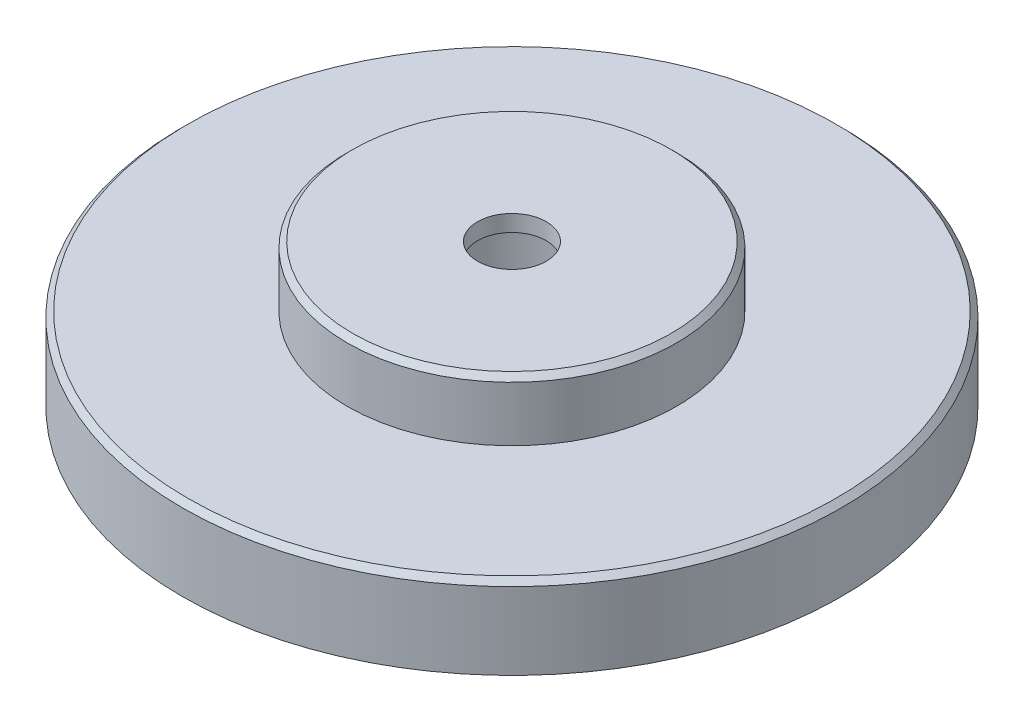
ISO-10303-21;
HEADER;
FILE_DESCRIPTION(('STEP AP214'),'2;1');
FILE_NAME('part.step','',(''),(''),'','','');
FILE_SCHEMA(('AUTOMOTIVE_DESIGN { 1 0 10303 214 1 1 1 1 }'));
ENDSEC;
DATA;
#1=APPLICATION_CONTEXT('core data for automotive mechanical design processes');
#2=APPLICATION_PROTOCOL_DEFINITION('international standard','automotive_design',2000,#1);
#3=PRODUCT_CONTEXT('',#1,'mechanical');
#4=PRODUCT('Part','Part','',(#3));
#5=PRODUCT_RELATED_PRODUCT_CATEGORY('part','',(#4));
#6=PRODUCT_DEFINITION_FORMATION('','',#4);
#7=PRODUCT_DEFINITION_CONTEXT('part definition',#1,'design');
#8=PRODUCT_DEFINITION('design','',#6,#7);
#9=PRODUCT_DEFINITION_SHAPE('','',#8);
#10=(LENGTH_UNIT() NAMED_UNIT(*) SI_UNIT(.MILLI.,.METRE.));
#11=(NAMED_UNIT(*) PLANE_ANGLE_UNIT() SI_UNIT($,.RADIAN.));
#12=(NAMED_UNIT(*) SI_UNIT($,.STERADIAN.) SOLID_ANGLE_UNIT());
#13=UNCERTAINTY_MEASURE_WITH_UNIT(LENGTH_MEASURE(1.E-05),#10,'distance_accuracy_value','');
#14=(GEOMETRIC_REPRESENTATION_CONTEXT(3) GLOBAL_UNCERTAINTY_ASSIGNED_CONTEXT((#13)) GLOBAL_UNIT_ASSIGNED_CONTEXT((#10,
#11,#12)) REPRESENTATION_CONTEXT('',''));
#15=CARTESIAN_POINT('',(0.,0.,0.));
#16=DIRECTION('',(0.,0.,1.));
#17=DIRECTION('',(1.,0.,0.));
#18=AXIS2_PLACEMENT_3D('',#15,#16,#17);
#19=CARTESIAN_POINT('',(0.,0.,0.));
#20=DIRECTION('',(0.,1.,0.));
#21=DIRECTION('',(0.,0.,1.));
#22=AXIS2_PLACEMENT_3D('',#19,#20,#21);
#23=PLANE('',#22);
#24=CARTESIAN_POINT('',(0.,0.,0.));
#25=DIRECTION('',(0.,1.,0.));
#26=DIRECTION('',(0.,0.,1.));
#27=AXIS2_PLACEMENT_3D('',#24,#25,#26);
#28=CIRCLE('',#27,12.);
#29=CARTESIAN_POINT('',(0.,0.,12.));
#30=VERTEX_POINT('',#29);
#31=EDGE_CURVE('E138',#30,#30,#28,.T.);
#32=ORIENTED_EDGE('',*,*,#31,.F.);
#33=EDGE_LOOP('',(#32));
#34=FACE_BOUND('',#33,.T.);
#35=DIRECTION('',(0.5,0.,0.866025403784439));
#36=VECTOR('',#35,1.);
#37=CARTESIAN_POINT('',(-9.81495457622364,0.,0.));
#38=LINE('',#37,#36);
#39=CARTESIAN_POINT('',(-9.81495457622364,0.,0.));
#40=VERTEX_POINT('',#39);
#41=CARTESIAN_POINT('',(-4.90747728811182,0.,8.5));
#42=VERTEX_POINT('',#41);
#43=EDGE_CURVE('E57',#40,#42,#38,.T.);
#44=ORIENTED_EDGE('',*,*,#43,.T.);
#45=DIRECTION('',(1.,0.,0.));
#46=VECTOR('',#45,1.);
#47=CARTESIAN_POINT('',(-4.90747728811182,0.,8.5));
#48=LINE('',#47,#46);
#49=CARTESIAN_POINT('',(4.90747728811182,0.,8.5));
#50=VERTEX_POINT('',#49);
#51=EDGE_CURVE('E117',#42,#50,#48,.T.);
#52=ORIENTED_EDGE('',*,*,#51,.T.);
#53=DIRECTION('',(0.5,0.,-0.866025403784439));
#54=VECTOR('',#53,1.);
#55=CARTESIAN_POINT('',(4.90747728811182,0.,8.5));
#56=LINE('',#55,#54);
#57=CARTESIAN_POINT('',(9.81495457622364,0.,0.));
#58=VERTEX_POINT('',#57);
#59=EDGE_CURVE('E113',#50,#58,#56,.T.);
#60=ORIENTED_EDGE('',*,*,#59,.T.);
#61=DIRECTION('',(-0.5,0.,-0.866025403784439));
#62=VECTOR('',#61,1.);
#63=CARTESIAN_POINT('',(9.81495457622364,0.,0.));
#64=LINE('',#63,#62);
#65=CARTESIAN_POINT('',(4.90747728811182,0.,-8.50000000000001));
#66=VERTEX_POINT('',#65);
#67=EDGE_CURVE('E92',#58,#66,#64,.T.);
#68=ORIENTED_EDGE('',*,*,#67,.T.);
#69=DIRECTION('',(-1.,0.,0.));
#70=VECTOR('',#69,1.);
#71=CARTESIAN_POINT('',(4.90747728811182,0.,-8.50000000000001));
#72=LINE('',#71,#70);
#73=CARTESIAN_POINT('',(-4.90747728811182,0.,-8.50000000000001));
#74=VERTEX_POINT('',#73);
#75=EDGE_CURVE('E102',#66,#74,#72,.T.);
#76=ORIENTED_EDGE('',*,*,#75,.T.);
#77=DIRECTION('',(-0.5,0.,0.866025403784439));
#78=VECTOR('',#77,1.);
#79=CARTESIAN_POINT('',(-4.90747728811182,0.,-8.50000000000001));
#80=LINE('',#79,#78);
#81=EDGE_CURVE('E109',#74,#40,#80,.T.);
#82=ORIENTED_EDGE('',*,*,#81,.T.);
#83=EDGE_LOOP('',(#44,#52,#60,#68,#76,#82));
#84=FACE_BOUND('',#83,.T.);
#85=ADVANCED_FACE('F40',(#34,#84),#23,.F.);
#86=CARTESIAN_POINT('',(0.,2.,0.));
#87=DIRECTION('',(0.,-1.,0.));
#88=DIRECTION('',(0.,0.,-1.));
#89=AXIS2_PLACEMENT_3D('',#86,#87,#88);
#90=CYLINDRICAL_SURFACE('',#89,12.);
#91=CARTESIAN_POINT('',(0.,2.8,0.));
#92=DIRECTION('',(0.,1.,0.));
#93=DIRECTION('',(0.,0.,1.));
#94=AXIS2_PLACEMENT_3D('',#91,#92,#93);
#95=CIRCLE('',#94,12.);
#96=CARTESIAN_POINT('',(0.,2.8,12.));
#97=VERTEX_POINT('',#96);
#98=EDGE_CURVE('E11',#97,#97,#95,.F.);
#99=ORIENTED_EDGE('',*,*,#98,.T.);
#100=EDGE_LOOP('',(#99));
#101=FACE_BOUND('',#100,.T.);
#102=ORIENTED_EDGE('',*,*,#31,.T.);
#103=EDGE_LOOP('',(#102));
#104=FACE_BOUND('',#103,.T.);
#105=ADVANCED_FACE('F167',(#101,#104),#90,.T.);
#106=CARTESIAN_POINT('',(-9.81495457622364,2.,0.));
#107=DIRECTION('',(0.866025403784439,0.,-0.5));
#108=DIRECTION('',(-0.5,0.,-0.866025403784439));
#109=AXIS2_PLACEMENT_3D('',#106,#107,#108);
#110=PLANE('',#109);
#111=ORIENTED_EDGE('',*,*,#43,.F.);
#112=DIRECTION('',(0.,-1.,0.));
#113=VECTOR('',#112,1.);
#114=CARTESIAN_POINT('',(-9.81495457622364,2.,0.));
#115=LINE('',#114,#113);
#116=CARTESIAN_POINT('',(-9.81495457622364,2.,0.));
#117=VERTEX_POINT('',#116);
#118=EDGE_CURVE('E124',#117,#40,#115,.T.);
#119=ORIENTED_EDGE('',*,*,#118,.F.);
#120=DIRECTION('',(0.5,0.,0.866025403784439));
#121=VECTOR('',#120,1.);
#122=CARTESIAN_POINT('',(-9.81495457622364,2.,0.));
#123=LINE('',#122,#121);
#124=CARTESIAN_POINT('',(-4.90747728811182,2.,8.5));
#125=VERTEX_POINT('',#124);
#126=EDGE_CURVE('E123',#117,#125,#123,.T.);
#127=ORIENTED_EDGE('',*,*,#126,.T.);
#128=DIRECTION('',(0.,-1.,0.));
#129=VECTOR('',#128,1.);
#130=CARTESIAN_POINT('',(-4.90747728811182,2.,8.5));
#131=LINE('',#130,#129);
#132=EDGE_CURVE('E135',#125,#42,#131,.T.);
#133=ORIENTED_EDGE('',*,*,#132,.T.);
#134=EDGE_LOOP('',(#111,#119,#127,#133));
#135=FACE_BOUND('',#134,.T.);
#136=ADVANCED_FACE('F174',(#135),#110,.T.);
#137=CARTESIAN_POINT('',(-4.90747728811182,2.,8.5));
#138=DIRECTION('',(0.,0.,-1.));
#139=DIRECTION('',(-1.,0.,0.));
#140=AXIS2_PLACEMENT_3D('',#137,#138,#139);
#141=PLANE('',#140);
#142=ORIENTED_EDGE('',*,*,#51,.F.);
#143=ORIENTED_EDGE('',*,*,#132,.F.);
#144=DIRECTION('',(1.,0.,0.));
#145=VECTOR('',#144,1.);
#146=CARTESIAN_POINT('',(-4.90747728811182,2.,8.5));
#147=LINE('',#146,#145);
#148=CARTESIAN_POINT('',(4.90747728811182,2.,8.5));
#149=VERTEX_POINT('',#148);
#150=EDGE_CURVE('E254',#125,#149,#147,.T.);
#151=ORIENTED_EDGE('',*,*,#150,.T.);
#152=DIRECTION('',(0.,-1.,0.));
#153=VECTOR('',#152,1.);
#154=CARTESIAN_POINT('',(4.90747728811182,2.,8.5));
#155=LINE('',#154,#153);
#156=EDGE_CURVE('E132',#149,#50,#155,.T.);
#157=ORIENTED_EDGE('',*,*,#156,.T.);
#158=EDGE_LOOP('',(#142,#143,#151,#157));
#159=FACE_BOUND('',#158,.T.);
#160=ADVANCED_FACE('F186',(#159),#141,.T.);
#161=CARTESIAN_POINT('',(4.90747728811182,2.,8.5));
#162=DIRECTION('',(-0.866025403784439,0.,-0.5));
#163=DIRECTION('',(-0.5,0.,0.866025403784439));
#164=AXIS2_PLACEMENT_3D('',#161,#162,#163);
#165=PLANE('',#164);
#166=ORIENTED_EDGE('',*,*,#59,.F.);
#167=ORIENTED_EDGE('',*,*,#156,.F.);
#168=DIRECTION('',(0.5,0.,-0.866025403784439));
#169=VECTOR('',#168,1.);
#170=CARTESIAN_POINT('',(4.90747728811182,2.,8.5));
#171=LINE('',#170,#169);
#172=CARTESIAN_POINT('',(9.81495457622364,2.,0.));
#173=VERTEX_POINT('',#172);
#174=EDGE_CURVE('E258',#149,#173,#171,.T.);
#175=ORIENTED_EDGE('',*,*,#174,.T.);
#176=DIRECTION('',(0.,-1.,0.));
#177=VECTOR('',#176,1.);
#178=CARTESIAN_POINT('',(9.81495457622364,2.,0.));
#179=LINE('',#178,#177);
#180=EDGE_CURVE('E98',#173,#58,#179,.T.);
#181=ORIENTED_EDGE('',*,*,#180,.T.);
#182=EDGE_LOOP('',(#166,#167,#175,#181));
#183=FACE_BOUND('',#182,.T.);
#184=ADVANCED_FACE('F189',(#183),#165,.T.);
#185=CARTESIAN_POINT('',(9.81495457622364,2.,0.));
#186=DIRECTION('',(-0.866025403784439,0.,0.5));
#187=DIRECTION('',(0.5,0.,0.866025403784439));
#188=AXIS2_PLACEMENT_3D('',#185,#186,#187);
#189=PLANE('',#188);
#190=ORIENTED_EDGE('',*,*,#67,.F.);
#191=ORIENTED_EDGE('',*,*,#180,.F.);
#192=DIRECTION('',(-0.5,0.,-0.866025403784439));
#193=VECTOR('',#192,1.);
#194=CARTESIAN_POINT('',(9.81495457622364,2.,0.));
#195=LINE('',#194,#193);
#196=CARTESIAN_POINT('',(4.90747728811182,2.,-8.50000000000001));
#197=VERTEX_POINT('',#196);
#198=EDGE_CURVE('E66',#173,#197,#195,.T.);
#199=ORIENTED_EDGE('',*,*,#198,.T.);
#200=DIRECTION('',(0.,-1.,0.));
#201=VECTOR('',#200,1.);
#202=CARTESIAN_POINT('',(4.90747728811182,2.,-8.50000000000001));
#203=LINE('',#202,#201);
#204=EDGE_CURVE('E87',#197,#66,#203,.T.);
#205=ORIENTED_EDGE('',*,*,#204,.T.);
#206=EDGE_LOOP('',(#190,#191,#199,#205));
#207=FACE_BOUND('',#206,.T.);
#208=ADVANCED_FACE('F89',(#207),#189,.T.);
#209=CARTESIAN_POINT('',(4.90747728811182,2.,-8.50000000000001));
#210=DIRECTION('',(0.,0.,1.));
#211=DIRECTION('',(1.,0.,0.));
#212=AXIS2_PLACEMENT_3D('',#209,#210,#211);
#213=PLANE('',#212);
#214=ORIENTED_EDGE('',*,*,#75,.F.);
#215=ORIENTED_EDGE('',*,*,#204,.F.);
#216=DIRECTION('',(-1.,0.,0.));
#217=VECTOR('',#216,1.);
#218=CARTESIAN_POINT('',(4.90747728811182,2.,-8.50000000000001));
#219=LINE('',#218,#217);
#220=CARTESIAN_POINT('',(-4.90747728811182,2.,-8.5));
#221=VERTEX_POINT('',#220);
#222=EDGE_CURVE('E263',#197,#221,#219,.T.);
#223=ORIENTED_EDGE('',*,*,#222,.T.);
#224=DIRECTION('',(0.,-1.,0.));
#225=VECTOR('',#224,1.);
#226=CARTESIAN_POINT('',(-4.90747728811182,2.,-8.50000000000001));
#227=LINE('',#226,#225);
#228=EDGE_CURVE('E99',#221,#74,#227,.T.);
#229=ORIENTED_EDGE('',*,*,#228,.T.);
#230=EDGE_LOOP('',(#214,#215,#223,#229));
#231=FACE_BOUND('',#230,.T.);
#232=ADVANCED_FACE('F103',(#231),#213,.T.);
#233=CARTESIAN_POINT('',(-4.90747728811182,2.,-8.50000000000001));
#234=DIRECTION('',(0.866025403784438,0.,0.5));
#235=DIRECTION('',(0.5,0.,-0.866025403784439));
#236=AXIS2_PLACEMENT_3D('',#233,#234,#235);
#237=PLANE('',#236);
#238=ORIENTED_EDGE('',*,*,#81,.F.);
#239=ORIENTED_EDGE('',*,*,#228,.F.);
#240=DIRECTION('',(-0.5,0.,0.866025403784439));
#241=VECTOR('',#240,1.);
#242=CARTESIAN_POINT('',(-4.90747728811182,2.,-8.50000000000001));
#243=LINE('',#242,#241);
#244=EDGE_CURVE('E127',#221,#117,#243,.T.);
#245=ORIENTED_EDGE('',*,*,#244,.T.);
#246=ORIENTED_EDGE('',*,*,#118,.T.);
#247=EDGE_LOOP('',(#238,#239,#245,#246));
#248=FACE_BOUND('',#247,.T.);
#249=ADVANCED_FACE('F198',(#248),#237,.T.);
#250=CARTESIAN_POINT('',(0.,2.,0.));
#251=DIRECTION('',(0.,1.,0.));
#252=DIRECTION('',(0.,0.,1.));
#253=AXIS2_PLACEMENT_3D('',#250,#251,#252);
#254=PLANE('',#253);
#255=CARTESIAN_POINT('',(0.,2.,0.));
#256=DIRECTION('',(0.,-1.,0.));
#257=DIRECTION('',(0.,0.,-1.));
#258=AXIS2_PLACEMENT_3D('',#255,#256,#257);
#259=CIRCLE('',#258,3.);
#260=CARTESIAN_POINT('',(0.,2.,-3.));
#261=VERTEX_POINT('',#260);
#262=EDGE_CURVE('E236',#261,#261,#259,.T.);
#263=ORIENTED_EDGE('',*,*,#262,.F.);
#264=EDGE_LOOP('',(#263));
#265=FACE_BOUND('',#264,.T.);
#266=ORIENTED_EDGE('',*,*,#150,.F.);
#267=ORIENTED_EDGE('',*,*,#126,.F.);
#268=ORIENTED_EDGE('',*,*,#244,.F.);
#269=ORIENTED_EDGE('',*,*,#222,.F.);
#270=ORIENTED_EDGE('',*,*,#198,.F.);
#271=ORIENTED_EDGE('',*,*,#174,.F.);
#272=EDGE_LOOP('',(#266,#267,#268,#269,#270,#271));
#273=FACE_BOUND('',#272,.T.);
#274=ADVANCED_FACE('F201',(#265,#273),#254,.F.);
#275=CARTESIAN_POINT('',(0.,3.,0.));
#276=DIRECTION('',(0.,1.,0.));
#277=DIRECTION('',(0.,0.,1.));
#278=AXIS2_PLACEMENT_3D('',#275,#276,#277);
#279=PLANE('',#278);
#280=CARTESIAN_POINT('',(0.,3.,0.));
#281=DIRECTION('',(0.,1.,0.));
#282=DIRECTION('',(0.,0.,1.));
#283=AXIS2_PLACEMENT_3D('',#280,#281,#282);
#284=CIRCLE('',#283,11.8);
#285=CARTESIAN_POINT('',(0.,3.,11.8));
#286=VERTEX_POINT('',#285);
#287=EDGE_CURVE('E50',#286,#286,#284,.T.);
#288=ORIENTED_EDGE('',*,*,#287,.T.);
#289=EDGE_LOOP('',(#288));
#290=FACE_BOUND('',#289,.T.);
#291=CARTESIAN_POINT('',(0.,3.,0.));
#292=DIRECTION('',(0.,1.,0.));
#293=DIRECTION('',(0.,0.,1.));
#294=AXIS2_PLACEMENT_3D('',#291,#292,#293);
#295=CIRCLE('',#294,6.);
#296=CARTESIAN_POINT('',(0.,3.,6.));
#297=VERTEX_POINT('',#296);
#298=EDGE_CURVE('E142',#297,#297,#295,.T.);
#299=ORIENTED_EDGE('',*,*,#298,.F.);
#300=EDGE_LOOP('',(#299));
#301=FACE_BOUND('',#300,.T.);
#302=ADVANCED_FACE('F154',(#290,#301),#279,.T.);
#303=CARTESIAN_POINT('',(0.,5.2,0.));
#304=DIRECTION('',(0.,-1.,0.));
#305=DIRECTION('',(0.,0.,-1.));
#306=AXIS2_PLACEMENT_3D('',#303,#304,#305);
#307=CYLINDRICAL_SURFACE('',#306,6.);
#308=CARTESIAN_POINT('',(0.,5.,0.));
#309=DIRECTION('',(0.,1.,0.));
#310=DIRECTION('',(0.,0.,1.));
#311=AXIS2_PLACEMENT_3D('',#308,#309,#310);
#312=CIRCLE('',#311,6.);
#313=CARTESIAN_POINT('',(0.,5.,6.));
#314=VERTEX_POINT('',#313);
#315=EDGE_CURVE('E147',#314,#314,#312,.F.);
#316=ORIENTED_EDGE('',*,*,#315,.T.);
#317=EDGE_LOOP('',(#316));
#318=FACE_BOUND('',#317,.T.);
#319=ORIENTED_EDGE('',*,*,#298,.T.);
#320=EDGE_LOOP('',(#319));
#321=FACE_BOUND('',#320,.T.);
#322=ADVANCED_FACE('F208',(#318,#321),#307,.T.);
#323=CARTESIAN_POINT('',(0.,5.2,0.));
#324=DIRECTION('',(0.,1.,0.));
#325=DIRECTION('',(0.,0.,1.));
#326=AXIS2_PLACEMENT_3D('',#323,#324,#325);
#327=PLANE('',#326);
#328=CARTESIAN_POINT('',(0.,5.2,0.));
#329=DIRECTION('',(0.,1.,0.));
#330=DIRECTION('',(0.,0.,1.));
#331=AXIS2_PLACEMENT_3D('',#328,#329,#330);
#332=CIRCLE('',#331,5.8);
#333=CARTESIAN_POINT('',(0.,5.2,5.8));
#334=VERTEX_POINT('',#333);
#335=EDGE_CURVE('E143',#334,#334,#332,.T.);
#336=ORIENTED_EDGE('',*,*,#335,.T.);
#337=EDGE_LOOP('',(#336));
#338=FACE_BOUND('',#337,.T.);
#339=CARTESIAN_POINT('',(0.,5.2,0.));
#340=DIRECTION('',(0.,1.,0.));
#341=DIRECTION('',(0.,0.,1.));
#342=AXIS2_PLACEMENT_3D('',#339,#340,#341);
#343=CIRCLE('',#342,1.25);
#344=CARTESIAN_POINT('',(0.,5.2,1.25));
#345=VERTEX_POINT('',#344);
#346=EDGE_CURVE('E231',#345,#345,#343,.F.);
#347=ORIENTED_EDGE('',*,*,#346,.T.);
#348=EDGE_LOOP('',(#347));
#349=FACE_BOUND('',#348,.T.);
#350=ADVANCED_FACE('F211',(#338,#349),#327,.T.);
#351=CARTESIAN_POINT('',(0.,4.6,0.));
#352=DIRECTION('',(0.,-1.,0.));
#353=DIRECTION('',(0.,0.,-1.));
#354=AXIS2_PLACEMENT_3D('',#351,#352,#353);
#355=CYLINDRICAL_SURFACE('',#354,3.);
#356=CARTESIAN_POINT('',(0.,4.6,0.));
#357=DIRECTION('',(0.,-1.,0.));
#358=DIRECTION('',(0.,0.,-1.));
#359=AXIS2_PLACEMENT_3D('',#356,#357,#358);
#360=CIRCLE('',#359,3.);
#361=CARTESIAN_POINT('',(0.,4.6,-3.));
#362=VERTEX_POINT('',#361);
#363=EDGE_CURVE('E241',#362,#362,#360,.T.);
#364=ORIENTED_EDGE('',*,*,#363,.F.);
#365=EDGE_LOOP('',(#364));
#366=FACE_BOUND('',#365,.T.);
#367=ORIENTED_EDGE('',*,*,#262,.T.);
#368=EDGE_LOOP('',(#367));
#369=FACE_BOUND('',#368,.T.);
#370=ADVANCED_FACE('F215',(#366,#369),#355,.F.);
#371=CARTESIAN_POINT('',(0.,4.6,0.));
#372=DIRECTION('',(0.,-1.,0.));
#373=DIRECTION('',(0.,0.,-1.));
#374=AXIS2_PLACEMENT_3D('',#371,#372,#373);
#375=PLANE('',#374);
#376=CARTESIAN_POINT('',(0.,4.6,0.));
#377=DIRECTION('',(0.,-1.,0.));
#378=DIRECTION('',(0.,0.,-1.));
#379=AXIS2_PLACEMENT_3D('',#376,#377,#378);
#380=CIRCLE('',#379,1.25);
#381=CARTESIAN_POINT('',(0.,4.6,-1.25));
#382=VERTEX_POINT('',#381);
#383=EDGE_CURVE('E234',#382,#382,#380,.T.);
#384=ORIENTED_EDGE('',*,*,#383,.F.);
#385=EDGE_LOOP('',(#384));
#386=FACE_BOUND('',#385,.T.);
#387=ORIENTED_EDGE('',*,*,#363,.T.);
#388=EDGE_LOOP('',(#387));
#389=FACE_BOUND('',#388,.T.);
#390=ADVANCED_FACE('F219',(#386,#389),#375,.T.);
#391=CARTESIAN_POINT('',(0.,5.201,0.));
#392=DIRECTION('',(0.,-1.,0.));
#393=DIRECTION('',(0.,0.,-1.));
#394=AXIS2_PLACEMENT_3D('',#391,#392,#393);
#395=CYLINDRICAL_SURFACE('',#394,1.25);
#396=ORIENTED_EDGE('',*,*,#346,.F.);
#397=EDGE_LOOP('',(#396));
#398=FACE_BOUND('',#397,.T.);
#399=ORIENTED_EDGE('',*,*,#383,.T.);
#400=EDGE_LOOP('',(#399));
#401=FACE_BOUND('',#400,.T.);
#402=ADVANCED_FACE('F163',(#398,#401),#395,.F.);
#403=CARTESIAN_POINT('',(0.,5.2,0.));
#404=DIRECTION('',(0.,-1.,0.));
#405=DIRECTION('',(0.,0.,-1.));
#406=AXIS2_PLACEMENT_3D('',#403,#404,#405);
#407=CONICAL_SURFACE('',#406,5.8,0.785398163397453);
#408=ORIENTED_EDGE('',*,*,#315,.F.);
#409=EDGE_LOOP('',(#408));
#410=FACE_BOUND('',#409,.T.);
#411=ORIENTED_EDGE('',*,*,#335,.F.);
#412=EDGE_LOOP('',(#411));
#413=FACE_BOUND('',#412,.T.);
#414=ADVANCED_FACE('F158',(#410,#413),#407,.T.);
#415=CARTESIAN_POINT('',(0.,3.,0.));
#416=DIRECTION('',(0.,-1.,0.));
#417=DIRECTION('',(0.,0.,-1.));
#418=AXIS2_PLACEMENT_3D('',#415,#416,#417);
#419=CONICAL_SURFACE('',#418,11.8,0.785398163397461);
#420=ORIENTED_EDGE('',*,*,#98,.F.);
#421=EDGE_LOOP('',(#420));
#422=FACE_BOUND('',#421,.T.);
#423=ORIENTED_EDGE('',*,*,#287,.F.);
#424=EDGE_LOOP('',(#423));
#425=FACE_BOUND('',#424,.T.);
#426=ADVANCED_FACE('F43',(#422,#425),#419,.T.);
#427=CLOSED_SHELL('',(#85,#105,#136,#160,#184,#208,#232,#249,#274,#302,#322,#350,#370,#390,#402,
#414,#426));
#428=MANIFOLD_SOLID_BREP('B2',#427);
#429=ADVANCED_BREP_SHAPE_REPRESENTATION('',(#18,#428),#14);
#430=SHAPE_DEFINITION_REPRESENTATION(#9,#429);
ENDSEC;
END-ISO-10303-21;
